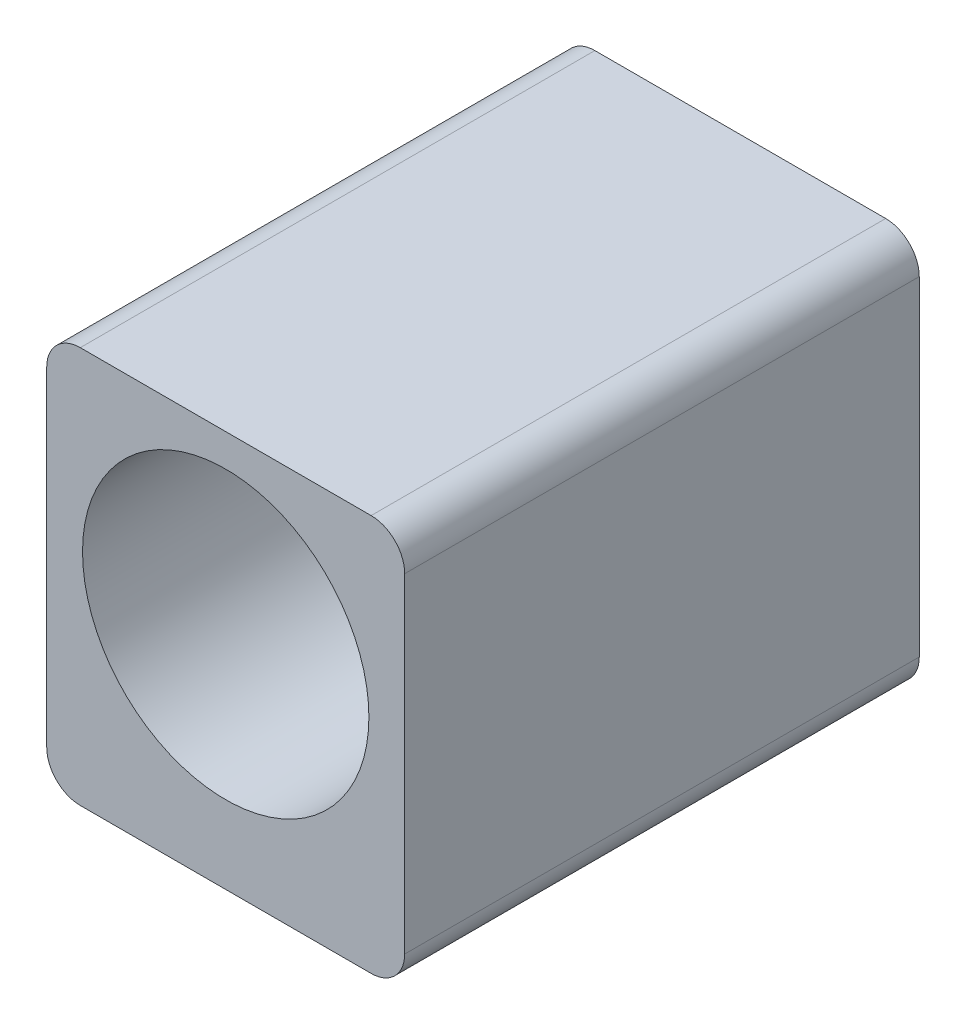
ISO-10303-21;
HEADER;
FILE_DESCRIPTION(('STEP AP214'),'2;1');
FILE_NAME('part.step','',(''),(''),'','','');
FILE_SCHEMA(('AUTOMOTIVE_DESIGN { 1 0 10303 214 1 1 1 1 }'));
ENDSEC;
DATA;
#1=APPLICATION_CONTEXT('core data for automotive mechanical design processes');
#2=APPLICATION_PROTOCOL_DEFINITION('international standard','automotive_design',2000,#1);
#3=PRODUCT_CONTEXT('',#1,'mechanical');
#4=PRODUCT('Part','Part','',(#3));
#5=PRODUCT_RELATED_PRODUCT_CATEGORY('part','',(#4));
#6=PRODUCT_DEFINITION_FORMATION('','',#4);
#7=PRODUCT_DEFINITION_CONTEXT('part definition',#1,'design');
#8=PRODUCT_DEFINITION('design','',#6,#7);
#9=PRODUCT_DEFINITION_SHAPE('','',#8);
#10=(LENGTH_UNIT() NAMED_UNIT(*) SI_UNIT(.MILLI.,.METRE.));
#11=(NAMED_UNIT(*) PLANE_ANGLE_UNIT() SI_UNIT($,.RADIAN.));
#12=(NAMED_UNIT(*) SI_UNIT($,.STERADIAN.) SOLID_ANGLE_UNIT());
#13=UNCERTAINTY_MEASURE_WITH_UNIT(LENGTH_MEASURE(1.E-05),#10,'distance_accuracy_value','');
#14=(GEOMETRIC_REPRESENTATION_CONTEXT(3) GLOBAL_UNCERTAINTY_ASSIGNED_CONTEXT((#13)) GLOBAL_UNIT_ASSIGNED_CONTEXT((#10,
#11,#12)) REPRESENTATION_CONTEXT('',''));
#15=CARTESIAN_POINT('',(0.,0.,0.));
#16=DIRECTION('',(0.,0.,1.));
#17=DIRECTION('',(1.,0.,0.));
#18=AXIS2_PLACEMENT_3D('',#15,#16,#17);
#19=CARTESIAN_POINT('',(-13.,-16.747,23.));
#20=DIRECTION('',(0.,0.,-1.));
#21=DIRECTION('',(-1.,0.,0.));
#22=AXIS2_PLACEMENT_3D('',#19,#20,#21);
#23=CYLINDRICAL_SURFACE('',#22,3.);
#24=CARTESIAN_POINT('',(-13.,-19.747,-15.7679491924311));
#25=CARTESIAN_POINT('',(-13.0476495419929,-19.747003246879,-15.7954566866554));
#26=CARTESIAN_POINT('',(-13.0941261367706,-19.7458644153685,-15.8249157263393));
#27=CARTESIAN_POINT('',(-13.1844127345255,-19.7416667729227,-15.887492356479));
#28=CARTESIAN_POINT('',(-13.2282244852853,-19.7386092356276,-15.9206075079945));
#29=CARTESIAN_POINT('',(-13.354971994891,-19.7271289054113,-16.0248805220334));
#30=CARTESIAN_POINT('',(-13.4335644856848,-19.7163931901029,-16.1011657594107));
#31=CARTESIAN_POINT('',(-13.5768998394832,-19.6919082719283,-16.2649958822506));
#32=CARTESIAN_POINT('',(-13.641668387287,-19.678164755528,-16.3525193936037));
#33=CARTESIAN_POINT('',(-13.7562389302473,-19.650717861115,-16.5369769090204));
#34=CARTESIAN_POINT('',(-13.8060301014096,-19.6370145191842,-16.633917652206));
#35=CARTESIAN_POINT('',(-13.8910629780802,-19.6119728605559,-16.8391498105373));
#36=CARTESIAN_POINT('',(-13.9256094605519,-19.6007573558681,-16.9477463151311));
#37=CARTESIAN_POINT('',(-13.9757945271664,-19.5839950421372,-17.1696173248816));
#38=CARTESIAN_POINT('',(-13.9914448364848,-19.5784447181504,-17.2828888839642));
#39=CARTESIAN_POINT('',(-14.0029639822057,-19.574383235086,-17.5056348392102));
#40=CARTESIAN_POINT('',(-13.999659217434,-19.5755779698607,-17.6150615404273));
#41=CARTESIAN_POINT('',(-13.9753162540335,-19.5840616133414,-17.8316710432726));
#42=CARTESIAN_POINT('',(-13.9542775064692,-19.5913507106914,-17.9388537753359));
#43=CARTESIAN_POINT('',(-13.8958183231178,-19.6102885845804,-18.145934761301));
#44=CARTESIAN_POINT('',(-13.8587245744734,-19.6218497797203,-18.2459341696921));
#45=CARTESIAN_POINT('',(-13.7692513439552,-19.6470696496689,-18.4386401815987));
#46=CARTESIAN_POINT('',(-13.7168589366862,-19.6607300934301,-18.5313405339215));
#47=CARTESIAN_POINT('',(-13.5946245265132,-19.6881843484393,-18.7123427309295));
#48=CARTESIAN_POINT('',(-13.5239601372463,-19.701941628559,-18.8000953033822));
#49=CARTESIAN_POINT('',(-13.3686421667565,-19.7252920015662,-18.9626663833322));
#50=CARTESIAN_POINT('',(-13.2840209392891,-19.7348945433787,-19.0375140040651));
#51=CARTESIAN_POINT('',(-13.162652445956,-19.7427496086829,-19.1278026107539));
#52=CARTESIAN_POINT('',(-13.1309719735022,-19.7443143003361,-19.1499699645611));
#53=CARTESIAN_POINT('',(-13.0663859430122,-19.7464389764101,-19.1924271085756));
#54=CARTESIAN_POINT('',(-13.0334815120283,-19.7469998628735,-19.212718568935));
#55=CARTESIAN_POINT('',(-13.,-19.747,-19.2320508075689));
#56=B_SPLINE_CURVE_WITH_KNOTS('',3,(#24,#25,#26,#27,#28,#29,#30,#31,#32,#33,#34,#35,#36,#37,#38,
#39,#40,#41,#42,#43,#44,#45,#46,#47,#48,#49,#50,#51,#52,#53,#54,#55),.UNSPECIFIED.,.F.,.F.,(4,2,
2,2,2,2,2,2,2,2,2,2,2,2,2,4),(0.,0.164928355044265,0.329747346002017,0.658207068340202,
0.986051097141595,1.31413148930953,1.65592666310572,1.9975096420087,2.32431683994227,
2.65113415419674,2.97159288998393,3.29232315937776,3.63127871423117,3.96945929389357,
4.08549092620192,4.20141823735249),.UNSPECIFIED.);
#57=CARTESIAN_POINT('',(-13.,-19.747,-15.7679491924311));
#58=VERTEX_POINT('',#57);
#59=CARTESIAN_POINT('',(-13.,-19.747,-19.2320508075689));
#60=VERTEX_POINT('',#59);
#61=EDGE_CURVE('E52',#58,#60,#56,.T.);
#62=ORIENTED_EDGE('',*,*,#61,.F.);
#63=DIRECTION('',(0.,0.,-1.));
#64=VECTOR('',#63,1.);
#65=CARTESIAN_POINT('',(-13.,-19.747,23.));
#66=LINE('',#65,#64);
#67=CARTESIAN_POINT('',(-13.,-19.747,23.));
#68=VERTEX_POINT('',#67);
#69=EDGE_CURVE('E116',#68,#58,#66,.T.);
#70=ORIENTED_EDGE('',*,*,#69,.F.);
#71=CARTESIAN_POINT('',(-13.,-16.747,23.));
#72=DIRECTION('',(0.,0.,1.));
#73=DIRECTION('',(1.,0.,0.));
#74=AXIS2_PLACEMENT_3D('',#71,#72,#73);
#75=CIRCLE('',#74,3.);
#76=CARTESIAN_POINT('',(-16.,-16.747,23.));
#77=VERTEX_POINT('',#76);
#78=EDGE_CURVE('E173',#77,#68,#75,.T.);
#79=ORIENTED_EDGE('',*,*,#78,.F.);
#80=DIRECTION('',(0.,0.,-1.));
#81=VECTOR('',#80,1.);
#82=CARTESIAN_POINT('',(-16.,-16.747,23.));
#83=LINE('',#82,#81);
#84=CARTESIAN_POINT('',(-16.,-16.747,-23.));
#85=VERTEX_POINT('',#84);
#86=EDGE_CURVE('E190',#77,#85,#83,.T.);
#87=ORIENTED_EDGE('',*,*,#86,.T.);
#88=CARTESIAN_POINT('',(-13.,-16.747,-23.));
#89=DIRECTION('',(0.,0.,1.));
#90=DIRECTION('',(1.,0.,0.));
#91=AXIS2_PLACEMENT_3D('',#88,#89,#90);
#92=CIRCLE('',#91,3.);
#93=CARTESIAN_POINT('',(-13.,-19.747,-23.));
#94=VERTEX_POINT('',#93);
#95=EDGE_CURVE('E170',#85,#94,#92,.T.);
#96=ORIENTED_EDGE('',*,*,#95,.T.);
#97=EDGE_CURVE('E130',#60,#94,#66,.T.);
#98=ORIENTED_EDGE('',*,*,#97,.F.);
#99=EDGE_LOOP('',(#62,#70,#79,#87,#96,#98));
#100=FACE_BOUND('',#99,.T.);
#101=ADVANCED_FACE('F39',(#100),#23,.T.);
#102=CARTESIAN_POINT('',(13.,-16.747,23.));
#103=DIRECTION('',(0.,0.,-1.));
#104=DIRECTION('',(-1.,0.,0.));
#105=AXIS2_PLACEMENT_3D('',#102,#103,#104);
#106=CYLINDRICAL_SURFACE('',#105,3.);
#107=CARTESIAN_POINT('',(13.,-19.747,15.7679491924311));
#108=CARTESIAN_POINT('',(13.0476495419929,-19.747003246879,15.7954566866554));
#109=CARTESIAN_POINT('',(13.0941261367706,-19.7458644153685,15.8249157263393));
#110=CARTESIAN_POINT('',(13.1844127345255,-19.7416667729227,15.887492356479));
#111=CARTESIAN_POINT('',(13.2282244852853,-19.7386092356276,15.9206075079945));
#112=CARTESIAN_POINT('',(13.354971994891,-19.7271289054113,16.0248805220334));
#113=CARTESIAN_POINT('',(13.4335644856848,-19.7163931901029,16.1011657594107));
#114=CARTESIAN_POINT('',(13.5768998394832,-19.6919082719283,16.2649958822506));
#115=CARTESIAN_POINT('',(13.641668387287,-19.678164755528,16.3525193936037));
#116=CARTESIAN_POINT('',(13.7562389302473,-19.650717861115,16.5369769090204));
#117=CARTESIAN_POINT('',(13.8060301014096,-19.6370145191842,16.633917652206));
#118=CARTESIAN_POINT('',(13.8910629780802,-19.6119728605559,16.8391498105373));
#119=CARTESIAN_POINT('',(13.9256094605519,-19.6007573558681,16.9477463151311));
#120=CARTESIAN_POINT('',(13.9757945271664,-19.5839950421372,17.1696173248816));
#121=CARTESIAN_POINT('',(13.9914448364848,-19.5784447181504,17.2828888839642));
#122=CARTESIAN_POINT('',(14.0029639822057,-19.574383235086,17.5056348392102));
#123=CARTESIAN_POINT('',(13.999659217434,-19.5755779698607,17.6150615404273));
#124=CARTESIAN_POINT('',(13.9753162540335,-19.5840616133414,17.8316710432726));
#125=CARTESIAN_POINT('',(13.9542775064692,-19.5913507106914,17.9388537753359));
#126=CARTESIAN_POINT('',(13.8958183231178,-19.6102885845804,18.145934761301));
#127=CARTESIAN_POINT('',(13.8587245744734,-19.6218497797203,18.2459341696921));
#128=CARTESIAN_POINT('',(13.7692513439552,-19.6470696496689,18.4386401815987));
#129=CARTESIAN_POINT('',(13.7168589366862,-19.6607300934301,18.5313405339215));
#130=CARTESIAN_POINT('',(13.5946245265132,-19.6881843484393,18.7123427309295));
#131=CARTESIAN_POINT('',(13.5239601372463,-19.701941628559,18.8000953033822));
#132=CARTESIAN_POINT('',(13.3686421667565,-19.7252920015662,18.9626663833322));
#133=CARTESIAN_POINT('',(13.2840209392891,-19.7348945433787,19.0375140040651));
#134=CARTESIAN_POINT('',(13.162652445956,-19.7427496086829,19.1278026107539));
#135=CARTESIAN_POINT('',(13.1309719735022,-19.7443143003361,19.1499699645611));
#136=CARTESIAN_POINT('',(13.0663859430122,-19.7464389764101,19.1924271085756));
#137=CARTESIAN_POINT('',(13.0334815120283,-19.7469998628735,19.212718568935));
#138=CARTESIAN_POINT('',(13.,-19.747,19.2320508075689));
#139=B_SPLINE_CURVE_WITH_KNOTS('',3,(#107,#108,#109,#110,#111,#112,#113,#114,#115,#116,#117,
#118,#119,#120,#121,#122,#123,#124,#125,#126,#127,#128,#129,#130,#131,#132,#133,#134,#135,#136,
#137,#138),.UNSPECIFIED.,.F.,.F.,(4,2,2,2,2,2,2,2,2,2,2,2,2,2,2,4),(0.,0.164928355044265,
0.329747346002017,0.658207068340202,0.986051097141595,1.31413148930953,1.65592666310572,
1.9975096420087,2.32431683994227,2.65113415419674,2.97159288998393,3.29232315937776,
3.63127871423117,3.96945929389357,4.08549092620192,4.20141823735249),.UNSPECIFIED.);
#140=CARTESIAN_POINT('',(13.,-19.747,15.7679491924311));
#141=VERTEX_POINT('',#140);
#142=CARTESIAN_POINT('',(13.,-19.747,19.2320508075689));
#143=VERTEX_POINT('',#142);
#144=EDGE_CURVE('E47',#141,#143,#139,.T.);
#145=ORIENTED_EDGE('',*,*,#144,.F.);
#146=DIRECTION('',(0.,0.,-1.));
#147=VECTOR('',#146,1.);
#148=CARTESIAN_POINT('',(13.,-19.747,23.));
#149=LINE('',#148,#147);
#150=CARTESIAN_POINT('',(13.,-19.747,-23.));
#151=VERTEX_POINT('',#150);
#152=EDGE_CURVE('E123',#141,#151,#149,.T.);
#153=ORIENTED_EDGE('',*,*,#152,.T.);
#154=CARTESIAN_POINT('',(13.,-16.747,-23.));
#155=DIRECTION('',(0.,0.,1.));
#156=DIRECTION('',(1.,0.,0.));
#157=AXIS2_PLACEMENT_3D('',#154,#155,#156);
#158=CIRCLE('',#157,3.);
#159=CARTESIAN_POINT('',(16.,-16.747,-23.));
#160=VERTEX_POINT('',#159);
#161=EDGE_CURVE('E195',#151,#160,#158,.T.);
#162=ORIENTED_EDGE('',*,*,#161,.T.);
#163=DIRECTION('',(0.,0.,-1.));
#164=VECTOR('',#163,1.);
#165=CARTESIAN_POINT('',(16.,-16.747,23.));
#166=LINE('',#165,#164);
#167=CARTESIAN_POINT('',(16.,-16.747,23.));
#168=VERTEX_POINT('',#167);
#169=EDGE_CURVE('E133',#168,#160,#166,.T.);
#170=ORIENTED_EDGE('',*,*,#169,.F.);
#171=CARTESIAN_POINT('',(13.,-16.747,23.));
#172=DIRECTION('',(0.,0.,1.));
#173=DIRECTION('',(1.,0.,0.));
#174=AXIS2_PLACEMENT_3D('',#171,#172,#173);
#175=CIRCLE('',#174,3.);
#176=CARTESIAN_POINT('',(13.,-19.747,23.));
#177=VERTEX_POINT('',#176);
#178=EDGE_CURVE('E129',#177,#168,#175,.T.);
#179=ORIENTED_EDGE('',*,*,#178,.F.);
#180=EDGE_CURVE('E120',#177,#143,#149,.T.);
#181=ORIENTED_EDGE('',*,*,#180,.T.);
#182=EDGE_LOOP('',(#145,#153,#162,#170,#179,#181));
#183=FACE_BOUND('',#182,.T.);
#184=ADVANCED_FACE('F127',(#183),#106,.T.);
#185=CARTESIAN_POINT('',(-13.,-16.747,23.));
#186=DIRECTION('',(0.,0.,1.));
#187=DIRECTION('',(1.,0.,0.));
#188=AXIS2_PLACEMENT_3D('',#185,#186,#187);
#189=PLANE('',#188);
#190=ORIENTED_EDGE('',*,*,#78,.T.);
#191=DIRECTION('',(1.,0.,0.));
#192=VECTOR('',#191,1.);
#193=CARTESIAN_POINT('',(-13.,-19.747,23.));
#194=LINE('',#193,#192);
#195=EDGE_CURVE('E176',#68,#177,#194,.T.);
#196=ORIENTED_EDGE('',*,*,#195,.T.);
#197=ORIENTED_EDGE('',*,*,#178,.T.);
#198=DIRECTION('',(0.,1.,0.));
#199=VECTOR('',#198,1.);
#200=CARTESIAN_POINT('',(16.,-16.747,23.));
#201=LINE('',#200,#199);
#202=CARTESIAN_POINT('',(16.,12.7,23.));
#203=VERTEX_POINT('',#202);
#204=EDGE_CURVE('E180',#168,#203,#201,.T.);
#205=ORIENTED_EDGE('',*,*,#204,.T.);
#206=CARTESIAN_POINT('',(13.,12.7,23.));
#207=DIRECTION('',(0.,0.,1.));
#208=DIRECTION('',(1.,0.,0.));
#209=AXIS2_PLACEMENT_3D('',#206,#207,#208);
#210=CIRCLE('',#209,3.);
#211=CARTESIAN_POINT('',(13.,15.7,23.));
#212=VERTEX_POINT('',#211);
#213=EDGE_CURVE('E182',#203,#212,#210,.T.);
#214=ORIENTED_EDGE('',*,*,#213,.T.);
#215=DIRECTION('',(-1.,0.,0.));
#216=VECTOR('',#215,1.);
#217=CARTESIAN_POINT('',(13.,15.7,23.));
#218=LINE('',#217,#216);
#219=CARTESIAN_POINT('',(-13.,15.7,23.));
#220=VERTEX_POINT('',#219);
#221=EDGE_CURVE('E184',#212,#220,#218,.T.);
#222=ORIENTED_EDGE('',*,*,#221,.T.);
#223=CARTESIAN_POINT('',(-13.,12.7,23.));
#224=DIRECTION('',(0.,0.,1.));
#225=DIRECTION('',(1.,0.,0.));
#226=AXIS2_PLACEMENT_3D('',#223,#224,#225);
#227=CIRCLE('',#226,3.);
#228=CARTESIAN_POINT('',(-16.,12.7,23.));
#229=VERTEX_POINT('',#228);
#230=EDGE_CURVE('E186',#220,#229,#227,.T.);
#231=ORIENTED_EDGE('',*,*,#230,.T.);
#232=DIRECTION('',(0.,-1.,0.));
#233=VECTOR('',#232,1.);
#234=CARTESIAN_POINT('',(-16.,12.7,23.));
#235=LINE('',#234,#233);
#236=EDGE_CURVE('E188',#229,#77,#235,.T.);
#237=ORIENTED_EDGE('',*,*,#236,.T.);
#238=EDGE_LOOP('',(#190,#196,#197,#205,#214,#222,#231,#237));
#239=FACE_BOUND('',#238,.T.);
#240=CARTESIAN_POINT('',(0.,0.,23.));
#241=DIRECTION('',(0.,0.,1.));
#242=DIRECTION('',(1.,0.,0.));
#243=AXIS2_PLACEMENT_3D('',#240,#241,#242);
#244=CIRCLE('',#243,12.8);
#245=CARTESIAN_POINT('',(12.8,0.,23.));
#246=VERTEX_POINT('',#245);
#247=EDGE_CURVE('E167',#246,#246,#244,.T.);
#248=ORIENTED_EDGE('',*,*,#247,.F.);
#249=EDGE_LOOP('',(#248));
#250=FACE_BOUND('',#249,.T.);
#251=ADVANCED_FACE('F243',(#239,#250),#189,.T.);
#252=CARTESIAN_POINT('',(-13.,-16.747,-23.));
#253=DIRECTION('',(0.,0.,1.));
#254=DIRECTION('',(1.,0.,0.));
#255=AXIS2_PLACEMENT_3D('',#252,#253,#254);
#256=PLANE('',#255);
#257=ORIENTED_EDGE('',*,*,#95,.F.);
#258=DIRECTION('',(0.,-1.,0.));
#259=VECTOR('',#258,1.);
#260=CARTESIAN_POINT('',(-16.,12.7,-23.));
#261=LINE('',#260,#259);
#262=CARTESIAN_POINT('',(-16.,12.7,-23.));
#263=VERTEX_POINT('',#262);
#264=EDGE_CURVE('E177',#263,#85,#261,.T.);
#265=ORIENTED_EDGE('',*,*,#264,.F.);
#266=CARTESIAN_POINT('',(-13.,12.7,-23.));
#267=DIRECTION('',(0.,0.,1.));
#268=DIRECTION('',(1.,0.,0.));
#269=AXIS2_PLACEMENT_3D('',#266,#267,#268);
#270=CIRCLE('',#269,3.);
#271=CARTESIAN_POINT('',(-13.,15.7,-23.));
#272=VERTEX_POINT('',#271);
#273=EDGE_CURVE('E203',#272,#263,#270,.T.);
#274=ORIENTED_EDGE('',*,*,#273,.F.);
#275=DIRECTION('',(-1.,0.,0.));
#276=VECTOR('',#275,1.);
#277=CARTESIAN_POINT('',(13.,15.7,-23.));
#278=LINE('',#277,#276);
#279=CARTESIAN_POINT('',(13.,15.7,-23.));
#280=VERTEX_POINT('',#279);
#281=EDGE_CURVE('E201',#280,#272,#278,.T.);
#282=ORIENTED_EDGE('',*,*,#281,.F.);
#283=CARTESIAN_POINT('',(13.,12.7,-23.));
#284=DIRECTION('',(0.,0.,1.));
#285=DIRECTION('',(1.,0.,0.));
#286=AXIS2_PLACEMENT_3D('',#283,#284,#285);
#287=CIRCLE('',#286,3.);
#288=CARTESIAN_POINT('',(16.,12.7,-23.));
#289=VERTEX_POINT('',#288);
#290=EDGE_CURVE('E199',#289,#280,#287,.T.);
#291=ORIENTED_EDGE('',*,*,#290,.F.);
#292=DIRECTION('',(0.,1.,0.));
#293=VECTOR('',#292,1.);
#294=CARTESIAN_POINT('',(16.,-16.747,-23.));
#295=LINE('',#294,#293);
#296=EDGE_CURVE('E197',#160,#289,#295,.T.);
#297=ORIENTED_EDGE('',*,*,#296,.F.);
#298=ORIENTED_EDGE('',*,*,#161,.F.);
#299=DIRECTION('',(1.,0.,0.));
#300=VECTOR('',#299,1.);
#301=CARTESIAN_POINT('',(-13.,-19.747,-23.));
#302=LINE('',#301,#300);
#303=EDGE_CURVE('E193',#94,#151,#302,.T.);
#304=ORIENTED_EDGE('',*,*,#303,.F.);
#305=EDGE_LOOP('',(#257,#265,#274,#282,#291,#297,#298,#304));
#306=FACE_BOUND('',#305,.T.);
#307=CARTESIAN_POINT('',(0.,0.,-23.));
#308=DIRECTION('',(0.,0.,1.));
#309=DIRECTION('',(1.,0.,0.));
#310=AXIS2_PLACEMENT_3D('',#307,#308,#309);
#311=CIRCLE('',#310,12.8);
#312=CARTESIAN_POINT('',(12.8,0.,-23.));
#313=VERTEX_POINT('',#312);
#314=EDGE_CURVE('E166',#313,#313,#311,.T.);
#315=ORIENTED_EDGE('',*,*,#314,.T.);
#316=EDGE_LOOP('',(#315));
#317=FACE_BOUND('',#316,.T.);
#318=ADVANCED_FACE('F230',(#306,#317),#256,.F.);
#319=CARTESIAN_POINT('',(-13.,-19.747,23.));
#320=DIRECTION('',(0.,1.,0.));
#321=DIRECTION('',(0.,0.,1.));
#322=AXIS2_PLACEMENT_3D('',#319,#320,#321);
#323=PLANE('',#322);
#324=CARTESIAN_POINT('',(12.,-19.747,17.5));
#325=DIRECTION('',(0.,1.,0.));
#326=DIRECTION('',(0.,0.,1.));
#327=AXIS2_PLACEMENT_3D('',#324,#325,#326);
#328=CIRCLE('',#327,2.);
#329=EDGE_CURVE('E59',#141,#143,#328,.T.);
#330=ORIENTED_EDGE('',*,*,#329,.T.);
#331=ORIENTED_EDGE('',*,*,#180,.F.);
#332=ORIENTED_EDGE('',*,*,#195,.F.);
#333=ORIENTED_EDGE('',*,*,#69,.T.);
#334=CARTESIAN_POINT('',(-12.,-19.747,-17.5));
#335=DIRECTION('',(0.,1.,0.));
#336=DIRECTION('',(0.,0.,1.));
#337=AXIS2_PLACEMENT_3D('',#334,#335,#336);
#338=CIRCLE('',#337,2.);
#339=EDGE_CURVE('E11',#60,#58,#338,.F.);
#340=ORIENTED_EDGE('',*,*,#339,.F.);
#341=ORIENTED_EDGE('',*,*,#97,.T.);
#342=ORIENTED_EDGE('',*,*,#303,.T.);
#343=ORIENTED_EDGE('',*,*,#152,.F.);
#344=EDGE_LOOP('',(#330,#331,#332,#333,#340,#341,#342,#343));
#345=FACE_BOUND('',#344,.T.);
#346=ADVANCED_FACE('F119',(#345),#323,.F.);
#347=CARTESIAN_POINT('',(16.,-16.747,23.));
#348=DIRECTION('',(-1.,0.,0.));
#349=DIRECTION('',(0.,0.,1.));
#350=AXIS2_PLACEMENT_3D('',#347,#348,#349);
#351=PLANE('',#350);
#352=ORIENTED_EDGE('',*,*,#296,.T.);
#353=DIRECTION('',(0.,0.,-1.));
#354=VECTOR('',#353,1.);
#355=CARTESIAN_POINT('',(16.,12.7,23.));
#356=LINE('',#355,#354);
#357=EDGE_CURVE('E216',#203,#289,#356,.T.);
#358=ORIENTED_EDGE('',*,*,#357,.F.);
#359=ORIENTED_EDGE('',*,*,#204,.F.);
#360=ORIENTED_EDGE('',*,*,#169,.T.);
#361=EDGE_LOOP('',(#352,#358,#359,#360));
#362=FACE_BOUND('',#361,.T.);
#363=ADVANCED_FACE('F226',(#362),#351,.F.);
#364=CARTESIAN_POINT('',(13.,12.7,23.));
#365=DIRECTION('',(0.,0.,-1.));
#366=DIRECTION('',(-1.,0.,0.));
#367=AXIS2_PLACEMENT_3D('',#364,#365,#366);
#368=CYLINDRICAL_SURFACE('',#367,3.);
#369=ORIENTED_EDGE('',*,*,#290,.T.);
#370=DIRECTION('',(0.,0.,-1.));
#371=VECTOR('',#370,1.);
#372=CARTESIAN_POINT('',(13.,15.7,23.));
#373=LINE('',#372,#371);
#374=EDGE_CURVE('E214',#212,#280,#373,.T.);
#375=ORIENTED_EDGE('',*,*,#374,.F.);
#376=ORIENTED_EDGE('',*,*,#213,.F.);
#377=ORIENTED_EDGE('',*,*,#357,.T.);
#378=EDGE_LOOP('',(#369,#375,#376,#377));
#379=FACE_BOUND('',#378,.T.);
#380=ADVANCED_FACE('F236',(#379),#368,.T.);
#381=CARTESIAN_POINT('',(13.,15.7,23.));
#382=DIRECTION('',(0.,-1.,0.));
#383=DIRECTION('',(0.,0.,-1.));
#384=AXIS2_PLACEMENT_3D('',#381,#382,#383);
#385=PLANE('',#384);
#386=ORIENTED_EDGE('',*,*,#281,.T.);
#387=DIRECTION('',(0.,0.,-1.));
#388=VECTOR('',#387,1.);
#389=CARTESIAN_POINT('',(-13.,15.7,23.));
#390=LINE('',#389,#388);
#391=EDGE_CURVE('E211',#220,#272,#390,.T.);
#392=ORIENTED_EDGE('',*,*,#391,.F.);
#393=ORIENTED_EDGE('',*,*,#221,.F.);
#394=ORIENTED_EDGE('',*,*,#374,.T.);
#395=EDGE_LOOP('',(#386,#392,#393,#394));
#396=FACE_BOUND('',#395,.T.);
#397=ADVANCED_FACE('F239',(#396),#385,.F.);
#398=CARTESIAN_POINT('',(-13.,12.7,23.));
#399=DIRECTION('',(0.,0.,-1.));
#400=DIRECTION('',(-1.,0.,0.));
#401=AXIS2_PLACEMENT_3D('',#398,#399,#400);
#402=CYLINDRICAL_SURFACE('',#401,3.);
#403=ORIENTED_EDGE('',*,*,#273,.T.);
#404=DIRECTION('',(0.,0.,-1.));
#405=VECTOR('',#404,1.);
#406=CARTESIAN_POINT('',(-16.,12.7,23.));
#407=LINE('',#406,#405);
#408=EDGE_CURVE('E208',#229,#263,#407,.T.);
#409=ORIENTED_EDGE('',*,*,#408,.F.);
#410=ORIENTED_EDGE('',*,*,#230,.F.);
#411=ORIENTED_EDGE('',*,*,#391,.T.);
#412=EDGE_LOOP('',(#403,#409,#410,#411));
#413=FACE_BOUND('',#412,.T.);
#414=ADVANCED_FACE('F256',(#413),#402,.T.);
#415=CARTESIAN_POINT('',(-16.,12.7,23.));
#416=DIRECTION('',(1.,0.,0.));
#417=DIRECTION('',(0.,0.,-1.));
#418=AXIS2_PLACEMENT_3D('',#415,#416,#417);
#419=PLANE('',#418);
#420=ORIENTED_EDGE('',*,*,#264,.T.);
#421=ORIENTED_EDGE('',*,*,#86,.F.);
#422=ORIENTED_EDGE('',*,*,#236,.F.);
#423=ORIENTED_EDGE('',*,*,#408,.T.);
#424=EDGE_LOOP('',(#420,#421,#422,#423));
#425=FACE_BOUND('',#424,.T.);
#426=ADVANCED_FACE('F253',(#425),#419,.F.);
#427=CARTESIAN_POINT('',(0.,0.,23.));
#428=DIRECTION('',(0.,0.,-1.));
#429=DIRECTION('',(-1.,0.,0.));
#430=AXIS2_PLACEMENT_3D('',#427,#428,#429);
#431=CYLINDRICAL_SURFACE('',#430,12.8);
#432=ORIENTED_EDGE('',*,*,#247,.T.);
#433=EDGE_LOOP('',(#432));
#434=FACE_BOUND('',#433,.T.);
#435=ORIENTED_EDGE('',*,*,#314,.F.);
#436=EDGE_LOOP('',(#435));
#437=FACE_BOUND('',#436,.T.);
#438=ADVANCED_FACE('F150',(#434,#437),#431,.F.);
#439=CARTESIAN_POINT('',(12.,-12.247,17.5));
#440=DIRECTION('',(0.,-1.,0.));
#441=DIRECTION('',(0.,0.,-1.));
#442=AXIS2_PLACEMENT_3D('',#439,#440,#441);
#443=CYLINDRICAL_SURFACE('',#442,2.);
#444=CARTESIAN_POINT('',(12.,-12.247,17.5));
#445=DIRECTION('',(0.,1.,0.));
#446=DIRECTION('',(0.,0.,1.));
#447=AXIS2_PLACEMENT_3D('',#444,#445,#446);
#448=CIRCLE('',#447,2.);
#449=CARTESIAN_POINT('',(12.,-12.247,19.5));
#450=VERTEX_POINT('',#449);
#451=EDGE_CURVE('E124',#450,#450,#448,.T.);
#452=ORIENTED_EDGE('',*,*,#451,.T.);
#453=EDGE_LOOP('',(#452));
#454=FACE_BOUND('',#453,.T.);
#455=ORIENTED_EDGE('',*,*,#144,.T.);
#456=ORIENTED_EDGE('',*,*,#329,.F.);
#457=EDGE_LOOP('',(#455,#456));
#458=FACE_BOUND('',#457,.T.);
#459=ADVANCED_FACE('F112',(#454,#458),#443,.F.);
#460=CARTESIAN_POINT('',(12.,-12.247,17.5));
#461=DIRECTION('',(0.,1.,0.));
#462=DIRECTION('',(0.,0.,1.));
#463=AXIS2_PLACEMENT_3D('',#460,#461,#462);
#464=PLANE('',#463);
#465=ORIENTED_EDGE('',*,*,#451,.F.);
#466=EDGE_LOOP('',(#465));
#467=FACE_BOUND('',#466,.T.);
#468=ADVANCED_FACE('F149',(#467),#464,.F.);
#469=CARTESIAN_POINT('',(-12.,-12.247,-17.5));
#470=DIRECTION('',(0.,-1.,0.));
#471=DIRECTION('',(0.,0.,-1.));
#472=AXIS2_PLACEMENT_3D('',#469,#470,#471);
#473=CYLINDRICAL_SURFACE('',#472,2.);
#474=CARTESIAN_POINT('',(-12.,-12.247,-17.5));
#475=DIRECTION('',(0.,1.,0.));
#476=DIRECTION('',(0.,0.,1.));
#477=AXIS2_PLACEMENT_3D('',#474,#475,#476);
#478=CIRCLE('',#477,2.);
#479=CARTESIAN_POINT('',(-12.,-12.247,-15.5));
#480=VERTEX_POINT('',#479);
#481=EDGE_CURVE('E125',#480,#480,#478,.T.);
#482=ORIENTED_EDGE('',*,*,#481,.T.);
#483=EDGE_LOOP('',(#482));
#484=FACE_BOUND('',#483,.T.);
#485=ORIENTED_EDGE('',*,*,#61,.T.);
#486=ORIENTED_EDGE('',*,*,#339,.T.);
#487=EDGE_LOOP('',(#485,#486));
#488=FACE_BOUND('',#487,.T.);
#489=ADVANCED_FACE('F152',(#484,#488),#473,.F.);
#490=CARTESIAN_POINT('',(-12.,-12.247,-17.5));
#491=DIRECTION('',(0.,1.,0.));
#492=DIRECTION('',(0.,0.,1.));
#493=AXIS2_PLACEMENT_3D('',#490,#491,#492);
#494=PLANE('',#493);
#495=ORIENTED_EDGE('',*,*,#481,.F.);
#496=EDGE_LOOP('',(#495));
#497=FACE_BOUND('',#496,.T.);
#498=ADVANCED_FACE('F156',(#497),#494,.F.);
#499=CLOSED_SHELL('',(#101,#184,#251,#318,#346,#363,#380,#397,#414,#426,#438,#459,#468,#489,#498));
#500=MANIFOLD_SOLID_BREP('B2',#499);
#501=ADVANCED_BREP_SHAPE_REPRESENTATION('',(#18,#500),#14);
#502=SHAPE_DEFINITION_REPRESENTATION(#9,#501);
ENDSEC;
END-ISO-10303-21;
